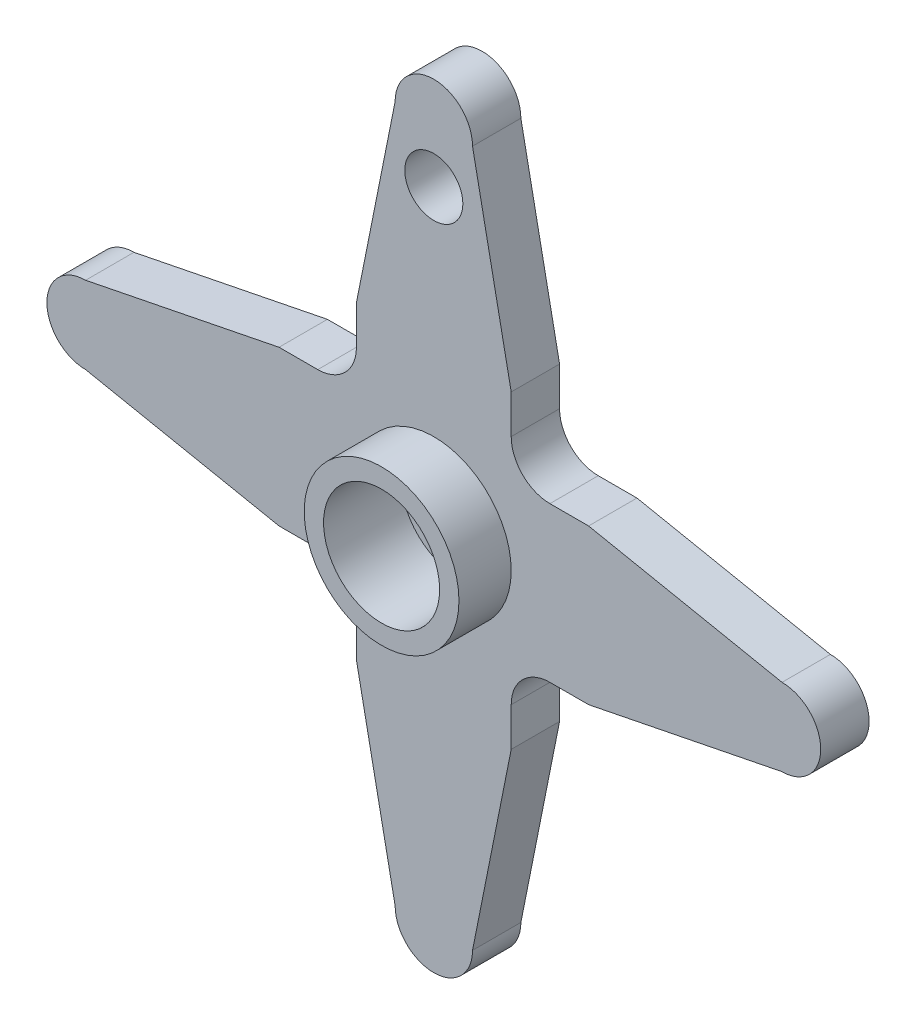
ISO-10303-21;
HEADER;
FILE_DESCRIPTION(('STEP AP214'),'2;1');
FILE_NAME('part.step','',(''),(''),'','','');
FILE_SCHEMA(('AUTOMOTIVE_DESIGN { 1 0 10303 214 1 1 1 1 }'));
ENDSEC;
DATA;
#1=APPLICATION_CONTEXT('core data for automotive mechanical design processes');
#2=APPLICATION_PROTOCOL_DEFINITION('international standard','automotive_design',2000,#1);
#3=PRODUCT_CONTEXT('',#1,'mechanical');
#4=PRODUCT('Part','Part','',(#3));
#5=PRODUCT_RELATED_PRODUCT_CATEGORY('part','',(#4));
#6=PRODUCT_DEFINITION_FORMATION('','',#4);
#7=PRODUCT_DEFINITION_CONTEXT('part definition',#1,'design');
#8=PRODUCT_DEFINITION('design','',#6,#7);
#9=PRODUCT_DEFINITION_SHAPE('','',#8);
#10=(LENGTH_UNIT() NAMED_UNIT(*) SI_UNIT(.MILLI.,.METRE.));
#11=(NAMED_UNIT(*) PLANE_ANGLE_UNIT() SI_UNIT($,.RADIAN.));
#12=(NAMED_UNIT(*) SI_UNIT($,.STERADIAN.) SOLID_ANGLE_UNIT());
#13=UNCERTAINTY_MEASURE_WITH_UNIT(LENGTH_MEASURE(1.E-05),#10,'distance_accuracy_value','');
#14=(GEOMETRIC_REPRESENTATION_CONTEXT(3) GLOBAL_UNCERTAINTY_ASSIGNED_CONTEXT((#13)) GLOBAL_UNIT_ASSIGNED_CONTEXT((#10,
#11,#12)) REPRESENTATION_CONTEXT('',''));
#15=CARTESIAN_POINT('',(0.,0.,0.));
#16=DIRECTION('',(0.,0.,1.));
#17=DIRECTION('',(1.,0.,0.));
#18=AXIS2_PLACEMENT_3D('',#15,#16,#17);
#19=CARTESIAN_POINT('',(0.,18.,2.5));
#20=DIRECTION('',(0.,0.,-1.));
#21=DIRECTION('',(-1.,0.,0.));
#22=AXIS2_PLACEMENT_3D('',#19,#20,#21);
#23=CYLINDRICAL_SURFACE('',#22,2.);
#24=CARTESIAN_POINT('',(0.,18.,0.));
#25=DIRECTION('',(0.,0.,1.));
#26=DIRECTION('',(1.,0.,0.));
#27=AXIS2_PLACEMENT_3D('',#24,#25,#26);
#28=CIRCLE('',#27,2.);
#29=CARTESIAN_POINT('',(2.,18.,0.));
#30=VERTEX_POINT('',#29);
#31=CARTESIAN_POINT('',(-2.,18.,0.));
#32=VERTEX_POINT('',#31);
#33=EDGE_CURVE('E275',#30,#32,#28,.T.);
#34=ORIENTED_EDGE('',*,*,#33,.T.);
#35=DIRECTION('',(0.,0.,-1.));
#36=VECTOR('',#35,1.);
#37=CARTESIAN_POINT('',(-2.,18.,2.5));
#38=LINE('',#37,#36);
#39=CARTESIAN_POINT('',(-2.,18.,2.5));
#40=VERTEX_POINT('',#39);
#41=EDGE_CURVE('E19',#40,#32,#38,.T.);
#42=ORIENTED_EDGE('',*,*,#41,.F.);
#43=CARTESIAN_POINT('',(0.,18.,2.5));
#44=DIRECTION('',(0.,0.,1.));
#45=DIRECTION('',(1.,0.,0.));
#46=AXIS2_PLACEMENT_3D('',#43,#44,#45);
#47=CIRCLE('',#46,2.);
#48=CARTESIAN_POINT('',(2.,18.,2.5));
#49=VERTEX_POINT('',#48);
#50=EDGE_CURVE('E153',#49,#40,#47,.T.);
#51=ORIENTED_EDGE('',*,*,#50,.F.);
#52=DIRECTION('',(0.,0.,-1.));
#53=VECTOR('',#52,1.);
#54=CARTESIAN_POINT('',(2.,18.,2.5));
#55=LINE('',#54,#53);
#56=EDGE_CURVE('E274',#49,#30,#55,.T.);
#57=ORIENTED_EDGE('',*,*,#56,.T.);
#58=EDGE_LOOP('',(#34,#42,#51,#57));
#59=FACE_BOUND('',#58,.T.);
#60=ADVANCED_FACE('F16',(#59),#23,.T.);
#61=CARTESIAN_POINT('',(-3.,13.,2.5));
#62=DIRECTION('',(-0.98058067569092,0.196116135138184,0.));
#63=DIRECTION('',(-0.196116135138184,-0.98058067569092,0.));
#64=AXIS2_PLACEMENT_3D('',#61,#62,#63);
#65=PLANE('',#64);
#66=DIRECTION('',(0.196116135138184,0.98058067569092,0.));
#67=VECTOR('',#66,1.);
#68=CARTESIAN_POINT('',(-3.,13.,0.));
#69=LINE('',#68,#67);
#70=CARTESIAN_POINT('',(-4.,8.,0.));
#71=VERTEX_POINT('',#70);
#72=EDGE_CURVE('E292',#71,#32,#69,.T.);
#73=ORIENTED_EDGE('',*,*,#72,.F.);
#74=DIRECTION('',(0.,0.,-1.));
#75=VECTOR('',#74,1.);
#76=CARTESIAN_POINT('',(-4.,8.,2.5));
#77=LINE('',#76,#75);
#78=CARTESIAN_POINT('',(-4.,8.,2.5));
#79=VERTEX_POINT('',#78);
#80=EDGE_CURVE('E410',#79,#71,#77,.T.);
#81=ORIENTED_EDGE('',*,*,#80,.F.);
#82=DIRECTION('',(0.196116135138184,0.98058067569092,0.));
#83=VECTOR('',#82,1.);
#84=CARTESIAN_POINT('',(-3.,13.,2.5));
#85=LINE('',#84,#83);
#86=EDGE_CURVE('E440',#79,#40,#85,.T.);
#87=ORIENTED_EDGE('',*,*,#86,.T.);
#88=ORIENTED_EDGE('',*,*,#41,.T.);
#89=EDGE_LOOP('',(#73,#81,#87,#88));
#90=FACE_BOUND('',#89,.T.);
#91=ADVANCED_FACE('F437',(#90),#65,.T.);
#92=CARTESIAN_POINT('',(-4.,7.,2.5));
#93=DIRECTION('',(1.,0.,0.));
#94=DIRECTION('',(0.,0.,-1.));
#95=AXIS2_PLACEMENT_3D('',#92,#93,#94);
#96=PLANE('',#95);
#97=DIRECTION('',(0.,-1.,0.));
#98=VECTOR('',#97,1.);
#99=CARTESIAN_POINT('',(-4.,7.,0.));
#100=LINE('',#99,#98);
#101=CARTESIAN_POINT('',(-4.,6.,0.));
#102=VERTEX_POINT('',#101);
#103=EDGE_CURVE('E296',#71,#102,#100,.T.);
#104=ORIENTED_EDGE('',*,*,#103,.T.);
#105=DIRECTION('',(0.,0.,-1.));
#106=VECTOR('',#105,1.);
#107=CARTESIAN_POINT('',(-4.,6.,2.5));
#108=LINE('',#107,#106);
#109=CARTESIAN_POINT('',(-4.,6.,2.5));
#110=VERTEX_POINT('',#109);
#111=EDGE_CURVE('E407',#110,#102,#108,.T.);
#112=ORIENTED_EDGE('',*,*,#111,.F.);
#113=DIRECTION('',(0.,-1.,0.));
#114=VECTOR('',#113,1.);
#115=CARTESIAN_POINT('',(-4.,7.,2.5));
#116=LINE('',#115,#114);
#117=EDGE_CURVE('E453',#79,#110,#116,.T.);
#118=ORIENTED_EDGE('',*,*,#117,.F.);
#119=ORIENTED_EDGE('',*,*,#80,.T.);
#120=EDGE_LOOP('',(#104,#112,#118,#119));
#121=FACE_BOUND('',#120,.T.);
#122=ADVANCED_FACE('F532',(#121),#96,.F.);
#123=CARTESIAN_POINT('',(-6.,6.,2.5));
#124=DIRECTION('',(0.,0.,-1.));
#125=DIRECTION('',(-1.,0.,0.));
#126=AXIS2_PLACEMENT_3D('',#123,#124,#125);
#127=CYLINDRICAL_SURFACE('',#126,2.);
#128=CARTESIAN_POINT('',(-6.,6.,0.));
#129=DIRECTION('',(0.,0.,1.));
#130=DIRECTION('',(1.,0.,0.));
#131=AXIS2_PLACEMENT_3D('',#128,#129,#130);
#132=CIRCLE('',#131,2.);
#133=CARTESIAN_POINT('',(-6.,4.,0.));
#134=VERTEX_POINT('',#133);
#135=EDGE_CURVE('E300',#134,#102,#132,.T.);
#136=ORIENTED_EDGE('',*,*,#135,.F.);
#137=DIRECTION('',(0.,0.,-1.));
#138=VECTOR('',#137,1.);
#139=CARTESIAN_POINT('',(-6.,4.,2.5));
#140=LINE('',#139,#138);
#141=CARTESIAN_POINT('',(-6.,4.,2.5));
#142=VERTEX_POINT('',#141);
#143=EDGE_CURVE('E403',#142,#134,#140,.T.);
#144=ORIENTED_EDGE('',*,*,#143,.F.);
#145=CARTESIAN_POINT('',(-6.,6.,2.5));
#146=DIRECTION('',(0.,0.,1.));
#147=DIRECTION('',(1.,0.,0.));
#148=AXIS2_PLACEMENT_3D('',#145,#146,#147);
#149=CIRCLE('',#148,2.);
#150=EDGE_CURVE('E458',#142,#110,#149,.T.);
#151=ORIENTED_EDGE('',*,*,#150,.T.);
#152=ORIENTED_EDGE('',*,*,#111,.T.);
#153=EDGE_LOOP('',(#136,#144,#151,#152));
#154=FACE_BOUND('',#153,.T.);
#155=ADVANCED_FACE('F537',(#154),#127,.F.);
#156=CARTESIAN_POINT('',(-7.,4.,2.5));
#157=DIRECTION('',(0.,1.,0.));
#158=DIRECTION('',(0.,0.,1.));
#159=AXIS2_PLACEMENT_3D('',#156,#157,#158);
#160=PLANE('',#159);
#161=DIRECTION('',(1.,0.,0.));
#162=VECTOR('',#161,1.);
#163=CARTESIAN_POINT('',(-7.,4.,0.));
#164=LINE('',#163,#162);
#165=CARTESIAN_POINT('',(-8.,4.,0.));
#166=VERTEX_POINT('',#165);
#167=EDGE_CURVE('E304',#166,#134,#164,.T.);
#168=ORIENTED_EDGE('',*,*,#167,.F.);
#169=DIRECTION('',(0.,0.,-1.));
#170=VECTOR('',#169,1.);
#171=CARTESIAN_POINT('',(-8.,4.,2.5));
#172=LINE('',#171,#170);
#173=CARTESIAN_POINT('',(-8.,4.,2.5));
#174=VERTEX_POINT('',#173);
#175=EDGE_CURVE('E400',#174,#166,#172,.T.);
#176=ORIENTED_EDGE('',*,*,#175,.F.);
#177=DIRECTION('',(1.,0.,0.));
#178=VECTOR('',#177,1.);
#179=CARTESIAN_POINT('',(-7.,4.,2.5));
#180=LINE('',#179,#178);
#181=EDGE_CURVE('E469',#174,#142,#180,.T.);
#182=ORIENTED_EDGE('',*,*,#181,.T.);
#183=ORIENTED_EDGE('',*,*,#143,.T.);
#184=EDGE_LOOP('',(#168,#176,#182,#183));
#185=FACE_BOUND('',#184,.T.);
#186=ADVANCED_FACE('F564',(#185),#160,.T.);
#187=CARTESIAN_POINT('',(-13.,3.,2.5));
#188=DIRECTION('',(0.196116135138184,-0.98058067569092,0.));
#189=DIRECTION('',(0.98058067569092,0.196116135138184,0.));
#190=AXIS2_PLACEMENT_3D('',#187,#188,#189);
#191=PLANE('',#190);
#192=DIRECTION('',(-0.98058067569092,-0.196116135138184,0.));
#193=VECTOR('',#192,1.);
#194=CARTESIAN_POINT('',(-13.,3.,0.));
#195=LINE('',#194,#193);
#196=CARTESIAN_POINT('',(-18.,2.,0.));
#197=VERTEX_POINT('',#196);
#198=EDGE_CURVE('E308',#166,#197,#195,.T.);
#199=ORIENTED_EDGE('',*,*,#198,.T.);
#200=DIRECTION('',(0.,0.,-1.));
#201=VECTOR('',#200,1.);
#202=CARTESIAN_POINT('',(-18.,2.,2.5));
#203=LINE('',#202,#201);
#204=CARTESIAN_POINT('',(-18.,2.,2.5));
#205=VERTEX_POINT('',#204);
#206=EDGE_CURVE('E404',#205,#197,#203,.T.);
#207=ORIENTED_EDGE('',*,*,#206,.F.);
#208=DIRECTION('',(-0.98058067569092,-0.196116135138184,0.));
#209=VECTOR('',#208,1.);
#210=CARTESIAN_POINT('',(-13.,3.,2.5));
#211=LINE('',#210,#209);
#212=EDGE_CURVE('E473',#174,#205,#211,.T.);
#213=ORIENTED_EDGE('',*,*,#212,.F.);
#214=ORIENTED_EDGE('',*,*,#175,.T.);
#215=EDGE_LOOP('',(#199,#207,#213,#214));
#216=FACE_BOUND('',#215,.T.);
#217=ADVANCED_FACE('F555',(#216),#191,.F.);
#218=CARTESIAN_POINT('',(-18.,0.,2.5));
#219=DIRECTION('',(0.,0.,-1.));
#220=DIRECTION('',(-1.,0.,0.));
#221=AXIS2_PLACEMENT_3D('',#218,#219,#220);
#222=CYLINDRICAL_SURFACE('',#221,2.);
#223=CARTESIAN_POINT('',(-18.,0.,0.));
#224=DIRECTION('',(0.,0.,1.));
#225=DIRECTION('',(1.,0.,0.));
#226=AXIS2_PLACEMENT_3D('',#223,#224,#225);
#227=CIRCLE('',#226,2.);
#228=CARTESIAN_POINT('',(-18.,-2.,0.));
#229=VERTEX_POINT('',#228);
#230=EDGE_CURVE('E279',#197,#229,#227,.T.);
#231=ORIENTED_EDGE('',*,*,#230,.T.);
#232=DIRECTION('',(0.,0.,-1.));
#233=VECTOR('',#232,1.);
#234=CARTESIAN_POINT('',(-18.,-2.,2.5));
#235=LINE('',#234,#233);
#236=CARTESIAN_POINT('',(-18.,-2.,2.5));
#237=VERTEX_POINT('',#236);
#238=EDGE_CURVE('E399',#237,#229,#235,.T.);
#239=ORIENTED_EDGE('',*,*,#238,.F.);
#240=CARTESIAN_POINT('',(-18.,0.,2.5));
#241=DIRECTION('',(0.,0.,1.));
#242=DIRECTION('',(1.,0.,0.));
#243=AXIS2_PLACEMENT_3D('',#240,#241,#242);
#244=CIRCLE('',#243,2.);
#245=EDGE_CURVE('E578',#205,#237,#244,.T.);
#246=ORIENTED_EDGE('',*,*,#245,.F.);
#247=ORIENTED_EDGE('',*,*,#206,.T.);
#248=EDGE_LOOP('',(#231,#239,#246,#247));
#249=FACE_BOUND('',#248,.T.);
#250=ADVANCED_FACE('F552',(#249),#222,.T.);
#251=CARTESIAN_POINT('',(-13.,-3.,2.5));
#252=DIRECTION('',(-0.196116135138184,-0.98058067569092,0.));
#253=DIRECTION('',(0.98058067569092,-0.196116135138184,0.));
#254=AXIS2_PLACEMENT_3D('',#251,#252,#253);
#255=PLANE('',#254);
#256=DIRECTION('',(-0.98058067569092,0.196116135138184,0.));
#257=VECTOR('',#256,1.);
#258=CARTESIAN_POINT('',(-13.,-3.,0.));
#259=LINE('',#258,#257);
#260=CARTESIAN_POINT('',(-8.,-4.,0.));
#261=VERTEX_POINT('',#260);
#262=EDGE_CURVE('E311',#261,#229,#259,.T.);
#263=ORIENTED_EDGE('',*,*,#262,.F.);
#264=DIRECTION('',(0.,0.,-1.));
#265=VECTOR('',#264,1.);
#266=CARTESIAN_POINT('',(-8.,-4.,2.5));
#267=LINE('',#266,#265);
#268=CARTESIAN_POINT('',(-8.,-4.,2.5));
#269=VERTEX_POINT('',#268);
#270=EDGE_CURVE('E396',#269,#261,#267,.T.);
#271=ORIENTED_EDGE('',*,*,#270,.F.);
#272=DIRECTION('',(-0.98058067569092,0.196116135138184,0.));
#273=VECTOR('',#272,1.);
#274=CARTESIAN_POINT('',(-13.,-3.,2.5));
#275=LINE('',#274,#273);
#276=EDGE_CURVE('E476',#269,#237,#275,.T.);
#277=ORIENTED_EDGE('',*,*,#276,.T.);
#278=ORIENTED_EDGE('',*,*,#238,.T.);
#279=EDGE_LOOP('',(#263,#271,#277,#278));
#280=FACE_BOUND('',#279,.T.);
#281=ADVANCED_FACE('F554',(#280),#255,.T.);
#282=CARTESIAN_POINT('',(-7.,-4.,2.5));
#283=DIRECTION('',(0.,1.,0.));
#284=DIRECTION('',(-1.,0.,0.));
#285=AXIS2_PLACEMENT_3D('',#282,#283,#284);
#286=PLANE('',#285);
#287=DIRECTION('',(1.,0.,0.));
#288=VECTOR('',#287,1.);
#289=CARTESIAN_POINT('',(-7.,-4.,0.));
#290=LINE('',#289,#288);
#291=CARTESIAN_POINT('',(-6.,-4.,0.));
#292=VERTEX_POINT('',#291);
#293=EDGE_CURVE('E315',#261,#292,#290,.T.);
#294=ORIENTED_EDGE('',*,*,#293,.T.);
#295=DIRECTION('',(0.,0.,-1.));
#296=VECTOR('',#295,1.);
#297=CARTESIAN_POINT('',(-6.,-4.,2.5));
#298=LINE('',#297,#296);
#299=CARTESIAN_POINT('',(-6.,-4.,2.5));
#300=VERTEX_POINT('',#299);
#301=EDGE_CURVE('E393',#300,#292,#298,.T.);
#302=ORIENTED_EDGE('',*,*,#301,.F.);
#303=DIRECTION('',(1.,0.,0.));
#304=VECTOR('',#303,1.);
#305=CARTESIAN_POINT('',(-7.,-4.,2.5));
#306=LINE('',#305,#304);
#307=EDGE_CURVE('E480',#269,#300,#306,.T.);
#308=ORIENTED_EDGE('',*,*,#307,.F.);
#309=ORIENTED_EDGE('',*,*,#270,.T.);
#310=EDGE_LOOP('',(#294,#302,#308,#309));
#311=FACE_BOUND('',#310,.T.);
#312=ADVANCED_FACE('F561',(#311),#286,.F.);
#313=CARTESIAN_POINT('',(-6.,-6.,2.5));
#314=DIRECTION('',(0.,0.,-1.));
#315=DIRECTION('',(-1.,0.,0.));
#316=AXIS2_PLACEMENT_3D('',#313,#314,#315);
#317=CYLINDRICAL_SURFACE('',#316,2.);
#318=CARTESIAN_POINT('',(-6.,-6.,0.));
#319=DIRECTION('',(0.,0.,1.));
#320=DIRECTION('',(1.,0.,0.));
#321=AXIS2_PLACEMENT_3D('',#318,#319,#320);
#322=CIRCLE('',#321,2.);
#323=CARTESIAN_POINT('',(-4.,-6.,0.));
#324=VERTEX_POINT('',#323);
#325=EDGE_CURVE('E319',#324,#292,#322,.T.);
#326=ORIENTED_EDGE('',*,*,#325,.F.);
#327=DIRECTION('',(0.,0.,-1.));
#328=VECTOR('',#327,1.);
#329=CARTESIAN_POINT('',(-4.,-6.,2.5));
#330=LINE('',#329,#328);
#331=CARTESIAN_POINT('',(-4.,-6.,2.5));
#332=VERTEX_POINT('',#331);
#333=EDGE_CURVE('E389',#332,#324,#330,.T.);
#334=ORIENTED_EDGE('',*,*,#333,.F.);
#335=CARTESIAN_POINT('',(-6.,-6.,2.5));
#336=DIRECTION('',(0.,0.,1.));
#337=DIRECTION('',(1.,0.,0.));
#338=AXIS2_PLACEMENT_3D('',#335,#336,#337);
#339=CIRCLE('',#338,2.);
#340=EDGE_CURVE('E483',#332,#300,#339,.T.);
#341=ORIENTED_EDGE('',*,*,#340,.T.);
#342=ORIENTED_EDGE('',*,*,#301,.T.);
#343=EDGE_LOOP('',(#326,#334,#341,#342));
#344=FACE_BOUND('',#343,.T.);
#345=ADVANCED_FACE('F681',(#344),#317,.F.);
#346=CARTESIAN_POINT('',(-4.,-7.,2.5));
#347=DIRECTION('',(-1.,0.,0.));
#348=DIRECTION('',(0.,0.,1.));
#349=AXIS2_PLACEMENT_3D('',#346,#347,#348);
#350=PLANE('',#349);
#351=DIRECTION('',(0.,1.,0.));
#352=VECTOR('',#351,1.);
#353=CARTESIAN_POINT('',(-4.,-7.,0.));
#354=LINE('',#353,#352);
#355=CARTESIAN_POINT('',(-4.,-8.,0.));
#356=VERTEX_POINT('',#355);
#357=EDGE_CURVE('E323',#356,#324,#354,.T.);
#358=ORIENTED_EDGE('',*,*,#357,.F.);
#359=DIRECTION('',(0.,0.,-1.));
#360=VECTOR('',#359,1.);
#361=CARTESIAN_POINT('',(-4.,-8.,2.5));
#362=LINE('',#361,#360);
#363=CARTESIAN_POINT('',(-4.,-8.,2.5));
#364=VERTEX_POINT('',#363);
#365=EDGE_CURVE('E386',#364,#356,#362,.T.);
#366=ORIENTED_EDGE('',*,*,#365,.F.);
#367=DIRECTION('',(0.,1.,0.));
#368=VECTOR('',#367,1.);
#369=CARTESIAN_POINT('',(-4.,-7.,2.5));
#370=LINE('',#369,#368);
#371=EDGE_CURVE('E487',#364,#332,#370,.T.);
#372=ORIENTED_EDGE('',*,*,#371,.T.);
#373=ORIENTED_EDGE('',*,*,#333,.T.);
#374=EDGE_LOOP('',(#358,#366,#372,#373));
#375=FACE_BOUND('',#374,.T.);
#376=ADVANCED_FACE('F674',(#375),#350,.T.);
#377=CARTESIAN_POINT('',(-3.,-13.,2.5));
#378=DIRECTION('',(0.98058067569092,0.196116135138184,0.));
#379=DIRECTION('',(-0.196116135138184,0.98058067569092,0.));
#380=AXIS2_PLACEMENT_3D('',#377,#378,#379);
#381=PLANE('',#380);
#382=DIRECTION('',(0.196116135138184,-0.98058067569092,0.));
#383=VECTOR('',#382,1.);
#384=CARTESIAN_POINT('',(-3.,-13.,0.));
#385=LINE('',#384,#383);
#386=CARTESIAN_POINT('',(-2.,-18.,0.));
#387=VERTEX_POINT('',#386);
#388=EDGE_CURVE('E327',#356,#387,#385,.T.);
#389=ORIENTED_EDGE('',*,*,#388,.T.);
#390=DIRECTION('',(0.,0.,-1.));
#391=VECTOR('',#390,1.);
#392=CARTESIAN_POINT('',(-2.,-18.,2.5));
#393=LINE('',#392,#391);
#394=CARTESIAN_POINT('',(-2.,-18.,2.5));
#395=VERTEX_POINT('',#394);
#396=EDGE_CURVE('E390',#395,#387,#393,.T.);
#397=ORIENTED_EDGE('',*,*,#396,.F.);
#398=DIRECTION('',(0.196116135138184,-0.98058067569092,0.));
#399=VECTOR('',#398,1.);
#400=CARTESIAN_POINT('',(-3.,-13.,2.5));
#401=LINE('',#400,#399);
#402=EDGE_CURVE('E491',#364,#395,#401,.T.);
#403=ORIENTED_EDGE('',*,*,#402,.F.);
#404=ORIENTED_EDGE('',*,*,#365,.T.);
#405=EDGE_LOOP('',(#389,#397,#403,#404));
#406=FACE_BOUND('',#405,.T.);
#407=ADVANCED_FACE('F550',(#406),#381,.F.);
#408=CARTESIAN_POINT('',(0.,-18.,2.5));
#409=DIRECTION('',(0.,0.,-1.));
#410=DIRECTION('',(-1.,0.,0.));
#411=AXIS2_PLACEMENT_3D('',#408,#409,#410);
#412=CYLINDRICAL_SURFACE('',#411,2.);
#413=CARTESIAN_POINT('',(0.,-18.,0.));
#414=DIRECTION('',(0.,0.,-1.));
#415=DIRECTION('',(1.,0.,0.));
#416=AXIS2_PLACEMENT_3D('',#413,#414,#415);
#417=CIRCLE('',#416,2.);
#418=CARTESIAN_POINT('',(2.,-18.,0.));
#419=VERTEX_POINT('',#418);
#420=EDGE_CURVE('E284',#419,#387,#417,.T.);
#421=ORIENTED_EDGE('',*,*,#420,.F.);
#422=DIRECTION('',(0.,0.,-1.));
#423=VECTOR('',#422,1.);
#424=CARTESIAN_POINT('',(2.,-18.,2.5));
#425=LINE('',#424,#423);
#426=CARTESIAN_POINT('',(2.,-18.,2.5));
#427=VERTEX_POINT('',#426);
#428=EDGE_CURVE('E385',#427,#419,#425,.T.);
#429=ORIENTED_EDGE('',*,*,#428,.F.);
#430=CARTESIAN_POINT('',(0.,-18.,2.5));
#431=DIRECTION('',(0.,0.,-1.));
#432=DIRECTION('',(1.,0.,0.));
#433=AXIS2_PLACEMENT_3D('',#430,#431,#432);
#434=CIRCLE('',#433,2.);
#435=EDGE_CURVE('E462',#427,#395,#434,.T.);
#436=ORIENTED_EDGE('',*,*,#435,.T.);
#437=ORIENTED_EDGE('',*,*,#396,.T.);
#438=EDGE_LOOP('',(#421,#429,#436,#437));
#439=FACE_BOUND('',#438,.T.);
#440=ADVANCED_FACE('F547',(#439),#412,.T.);
#441=CARTESIAN_POINT('',(3.,-13.,2.5));
#442=DIRECTION('',(0.98058067569092,-0.196116135138184,0.));
#443=DIRECTION('',(0.196116135138184,0.98058067569092,0.));
#444=AXIS2_PLACEMENT_3D('',#441,#442,#443);
#445=PLANE('',#444);
#446=DIRECTION('',(-0.196116135138184,-0.98058067569092,0.));
#447=VECTOR('',#446,1.);
#448=CARTESIAN_POINT('',(3.,-13.,0.));
#449=LINE('',#448,#447);
#450=CARTESIAN_POINT('',(4.,-8.,0.));
#451=VERTEX_POINT('',#450);
#452=EDGE_CURVE('E331',#451,#419,#449,.T.);
#453=ORIENTED_EDGE('',*,*,#452,.F.);
#454=DIRECTION('',(0.,0.,-1.));
#455=VECTOR('',#454,1.);
#456=CARTESIAN_POINT('',(4.,-8.,2.5));
#457=LINE('',#456,#455);
#458=CARTESIAN_POINT('',(4.,-8.,2.5));
#459=VERTEX_POINT('',#458);
#460=EDGE_CURVE('E382',#459,#451,#457,.T.);
#461=ORIENTED_EDGE('',*,*,#460,.F.);
#462=DIRECTION('',(-0.196116135138184,-0.98058067569092,0.));
#463=VECTOR('',#462,1.);
#464=CARTESIAN_POINT('',(3.,-13.,2.5));
#465=LINE('',#464,#463);
#466=EDGE_CURVE('E494',#459,#427,#465,.T.);
#467=ORIENTED_EDGE('',*,*,#466,.T.);
#468=ORIENTED_EDGE('',*,*,#428,.T.);
#469=EDGE_LOOP('',(#453,#461,#467,#468));
#470=FACE_BOUND('',#469,.T.);
#471=ADVANCED_FACE('F549',(#470),#445,.T.);
#472=CARTESIAN_POINT('',(4.,-7.,2.5));
#473=DIRECTION('',(-1.,0.,0.));
#474=DIRECTION('',(0.,0.,1.));
#475=AXIS2_PLACEMENT_3D('',#472,#473,#474);
#476=PLANE('',#475);
#477=DIRECTION('',(0.,1.,0.));
#478=VECTOR('',#477,1.);
#479=CARTESIAN_POINT('',(4.,-7.,0.));
#480=LINE('',#479,#478);
#481=CARTESIAN_POINT('',(4.,-6.,0.));
#482=VERTEX_POINT('',#481);
#483=EDGE_CURVE('E335',#451,#482,#480,.T.);
#484=ORIENTED_EDGE('',*,*,#483,.T.);
#485=DIRECTION('',(0.,0.,-1.));
#486=VECTOR('',#485,1.);
#487=CARTESIAN_POINT('',(4.,-6.,2.5));
#488=LINE('',#487,#486);
#489=CARTESIAN_POINT('',(4.,-6.,2.5));
#490=VERTEX_POINT('',#489);
#491=EDGE_CURVE('E379',#490,#482,#488,.T.);
#492=ORIENTED_EDGE('',*,*,#491,.F.);
#493=DIRECTION('',(0.,1.,0.));
#494=VECTOR('',#493,1.);
#495=CARTESIAN_POINT('',(4.,-7.,2.5));
#496=LINE('',#495,#494);
#497=EDGE_CURVE('E498',#459,#490,#496,.T.);
#498=ORIENTED_EDGE('',*,*,#497,.F.);
#499=ORIENTED_EDGE('',*,*,#460,.T.);
#500=EDGE_LOOP('',(#484,#492,#498,#499));
#501=FACE_BOUND('',#500,.T.);
#502=ADVANCED_FACE('F688',(#501),#476,.F.);
#503=CARTESIAN_POINT('',(6.,-6.,2.5));
#504=DIRECTION('',(0.,0.,-1.));
#505=DIRECTION('',(-1.,0.,0.));
#506=AXIS2_PLACEMENT_3D('',#503,#504,#505);
#507=CYLINDRICAL_SURFACE('',#506,2.);
#508=CARTESIAN_POINT('',(6.,-6.,0.));
#509=DIRECTION('',(0.,0.,1.));
#510=DIRECTION('',(1.,0.,0.));
#511=AXIS2_PLACEMENT_3D('',#508,#509,#510);
#512=CIRCLE('',#511,2.);
#513=CARTESIAN_POINT('',(6.,-4.,0.));
#514=VERTEX_POINT('',#513);
#515=EDGE_CURVE('E339',#514,#482,#512,.T.);
#516=ORIENTED_EDGE('',*,*,#515,.F.);
#517=DIRECTION('',(0.,0.,-1.));
#518=VECTOR('',#517,1.);
#519=CARTESIAN_POINT('',(6.,-4.,2.5));
#520=LINE('',#519,#518);
#521=CARTESIAN_POINT('',(6.,-4.,2.5));
#522=VERTEX_POINT('',#521);
#523=EDGE_CURVE('E375',#522,#514,#520,.T.);
#524=ORIENTED_EDGE('',*,*,#523,.F.);
#525=CARTESIAN_POINT('',(6.,-6.,2.5));
#526=DIRECTION('',(0.,0.,1.));
#527=DIRECTION('',(1.,0.,0.));
#528=AXIS2_PLACEMENT_3D('',#525,#526,#527);
#529=CIRCLE('',#528,2.);
#530=EDGE_CURVE('E501',#522,#490,#529,.T.);
#531=ORIENTED_EDGE('',*,*,#530,.T.);
#532=ORIENTED_EDGE('',*,*,#491,.T.);
#533=EDGE_LOOP('',(#516,#524,#531,#532));
#534=FACE_BOUND('',#533,.T.);
#535=ADVANCED_FACE('F695',(#534),#507,.F.);
#536=CARTESIAN_POINT('',(7.,-4.,2.5));
#537=DIRECTION('',(0.,-1.,0.));
#538=DIRECTION('',(1.,0.,0.));
#539=AXIS2_PLACEMENT_3D('',#536,#537,#538);
#540=PLANE('',#539);
#541=DIRECTION('',(-1.,0.,0.));
#542=VECTOR('',#541,1.);
#543=CARTESIAN_POINT('',(7.,-4.,0.));
#544=LINE('',#543,#542);
#545=CARTESIAN_POINT('',(8.,-4.,0.));
#546=VERTEX_POINT('',#545);
#547=EDGE_CURVE('E342',#546,#514,#544,.T.);
#548=ORIENTED_EDGE('',*,*,#547,.F.);
#549=DIRECTION('',(0.,0.,-1.));
#550=VECTOR('',#549,1.);
#551=CARTESIAN_POINT('',(8.,-4.,2.5));
#552=LINE('',#551,#550);
#553=CARTESIAN_POINT('',(8.,-4.,2.5));
#554=VERTEX_POINT('',#553);
#555=EDGE_CURVE('E372',#554,#546,#552,.T.);
#556=ORIENTED_EDGE('',*,*,#555,.F.);
#557=DIRECTION('',(-1.,0.,0.));
#558=VECTOR('',#557,1.);
#559=CARTESIAN_POINT('',(7.,-4.,2.5));
#560=LINE('',#559,#558);
#561=EDGE_CURVE('E505',#554,#522,#560,.T.);
#562=ORIENTED_EDGE('',*,*,#561,.T.);
#563=ORIENTED_EDGE('',*,*,#523,.T.);
#564=EDGE_LOOP('',(#548,#556,#562,#563));
#565=FACE_BOUND('',#564,.T.);
#566=ADVANCED_FACE('F726',(#565),#540,.T.);
#567=CARTESIAN_POINT('',(13.,-3.,2.5));
#568=DIRECTION('',(-0.196116135138184,0.98058067569092,0.));
#569=DIRECTION('',(-0.98058067569092,-0.196116135138184,0.));
#570=AXIS2_PLACEMENT_3D('',#567,#568,#569);
#571=PLANE('',#570);
#572=DIRECTION('',(0.98058067569092,0.196116135138184,0.));
#573=VECTOR('',#572,1.);
#574=CARTESIAN_POINT('',(13.,-3.,0.));
#575=LINE('',#574,#573);
#576=CARTESIAN_POINT('',(18.,-2.,0.));
#577=VERTEX_POINT('',#576);
#578=EDGE_CURVE('E346',#546,#577,#575,.T.);
#579=ORIENTED_EDGE('',*,*,#578,.T.);
#580=DIRECTION('',(0.,0.,-1.));
#581=VECTOR('',#580,1.);
#582=CARTESIAN_POINT('',(18.,-2.,2.5));
#583=LINE('',#582,#581);
#584=CARTESIAN_POINT('',(18.,-2.,2.5));
#585=VERTEX_POINT('',#584);
#586=EDGE_CURVE('E376',#585,#577,#583,.T.);
#587=ORIENTED_EDGE('',*,*,#586,.F.);
#588=DIRECTION('',(0.98058067569092,0.196116135138184,0.));
#589=VECTOR('',#588,1.);
#590=CARTESIAN_POINT('',(13.,-3.,2.5));
#591=LINE('',#590,#589);
#592=EDGE_CURVE('E509',#554,#585,#591,.T.);
#593=ORIENTED_EDGE('',*,*,#592,.F.);
#594=ORIENTED_EDGE('',*,*,#555,.T.);
#595=EDGE_LOOP('',(#579,#587,#593,#594));
#596=FACE_BOUND('',#595,.T.);
#597=ADVANCED_FACE('F545',(#596),#571,.F.);
#598=CARTESIAN_POINT('',(18.,0.,2.5));
#599=DIRECTION('',(0.,0.,-1.));
#600=DIRECTION('',(-1.,0.,0.));
#601=AXIS2_PLACEMENT_3D('',#598,#599,#600);
#602=CYLINDRICAL_SURFACE('',#601,2.);
#603=CARTESIAN_POINT('',(18.,0.,0.));
#604=DIRECTION('',(0.,0.,-1.));
#605=DIRECTION('',(1.,0.,0.));
#606=AXIS2_PLACEMENT_3D('',#603,#604,#605);
#607=CIRCLE('',#606,2.);
#608=CARTESIAN_POINT('',(18.,2.,0.));
#609=VERTEX_POINT('',#608);
#610=EDGE_CURVE('E288',#609,#577,#607,.T.);
#611=ORIENTED_EDGE('',*,*,#610,.F.);
#612=DIRECTION('',(0.,0.,-1.));
#613=VECTOR('',#612,1.);
#614=CARTESIAN_POINT('',(18.,2.,2.5));
#615=LINE('',#614,#613);
#616=CARTESIAN_POINT('',(18.,2.,2.5));
#617=VERTEX_POINT('',#616);
#618=EDGE_CURVE('E371',#617,#609,#615,.T.);
#619=ORIENTED_EDGE('',*,*,#618,.F.);
#620=CARTESIAN_POINT('',(18.,0.,2.5));
#621=DIRECTION('',(0.,0.,-1.));
#622=DIRECTION('',(1.,0.,0.));
#623=AXIS2_PLACEMENT_3D('',#620,#621,#622);
#624=CIRCLE('',#623,2.);
#625=EDGE_CURVE('E454',#617,#585,#624,.T.);
#626=ORIENTED_EDGE('',*,*,#625,.T.);
#627=ORIENTED_EDGE('',*,*,#586,.T.);
#628=EDGE_LOOP('',(#611,#619,#626,#627));
#629=FACE_BOUND('',#628,.T.);
#630=ADVANCED_FACE('F542',(#629),#602,.T.);
#631=CARTESIAN_POINT('',(13.,3.,2.5));
#632=DIRECTION('',(0.196116135138184,0.98058067569092,0.));
#633=DIRECTION('',(-0.98058067569092,0.196116135138184,0.));
#634=AXIS2_PLACEMENT_3D('',#631,#632,#633);
#635=PLANE('',#634);
#636=DIRECTION('',(0.98058067569092,-0.196116135138184,0.));
#637=VECTOR('',#636,1.);
#638=CARTESIAN_POINT('',(13.,3.,0.));
#639=LINE('',#638,#637);
#640=CARTESIAN_POINT('',(8.,4.,0.));
#641=VERTEX_POINT('',#640);
#642=EDGE_CURVE('E350',#641,#609,#639,.T.);
#643=ORIENTED_EDGE('',*,*,#642,.F.);
#644=DIRECTION('',(0.,0.,-1.));
#645=VECTOR('',#644,1.);
#646=CARTESIAN_POINT('',(8.,4.,2.5));
#647=LINE('',#646,#645);
#648=CARTESIAN_POINT('',(8.,4.,2.5));
#649=VERTEX_POINT('',#648);
#650=EDGE_CURVE('E258',#649,#641,#647,.T.);
#651=ORIENTED_EDGE('',*,*,#650,.F.);
#652=DIRECTION('',(0.98058067569092,-0.196116135138184,0.));
#653=VECTOR('',#652,1.);
#654=CARTESIAN_POINT('',(13.,3.,2.5));
#655=LINE('',#654,#653);
#656=EDGE_CURVE('E246',#649,#617,#655,.T.);
#657=ORIENTED_EDGE('',*,*,#656,.T.);
#658=ORIENTED_EDGE('',*,*,#618,.T.);
#659=EDGE_LOOP('',(#643,#651,#657,#658));
#660=FACE_BOUND('',#659,.T.);
#661=ADVANCED_FACE('F515',(#660),#635,.T.);
#662=CARTESIAN_POINT('',(7.,4.,2.5));
#663=DIRECTION('',(0.,-1.,0.));
#664=DIRECTION('',(0.,0.,-1.));
#665=AXIS2_PLACEMENT_3D('',#662,#663,#664);
#666=PLANE('',#665);
#667=DIRECTION('',(-1.,0.,0.));
#668=VECTOR('',#667,1.);
#669=CARTESIAN_POINT('',(7.,4.,0.));
#670=LINE('',#669,#668);
#671=CARTESIAN_POINT('',(6.,4.,0.));
#672=VERTEX_POINT('',#671);
#673=EDGE_CURVE('E254',#641,#672,#670,.T.);
#674=ORIENTED_EDGE('',*,*,#673,.T.);
#675=DIRECTION('',(0.,0.,-1.));
#676=VECTOR('',#675,1.);
#677=CARTESIAN_POINT('',(6.,4.,2.5));
#678=LINE('',#677,#676);
#679=CARTESIAN_POINT('',(6.,4.,2.5));
#680=VERTEX_POINT('',#679);
#681=EDGE_CURVE('E251',#680,#672,#678,.T.);
#682=ORIENTED_EDGE('',*,*,#681,.F.);
#683=DIRECTION('',(-1.,0.,0.));
#684=VECTOR('',#683,1.);
#685=CARTESIAN_POINT('',(7.,4.,2.5));
#686=LINE('',#685,#684);
#687=EDGE_CURVE('E238',#649,#680,#686,.T.);
#688=ORIENTED_EDGE('',*,*,#687,.F.);
#689=ORIENTED_EDGE('',*,*,#650,.T.);
#690=EDGE_LOOP('',(#674,#682,#688,#689));
#691=FACE_BOUND('',#690,.T.);
#692=ADVANCED_FACE('F252',(#691),#666,.F.);
#693=CARTESIAN_POINT('',(6.,6.,2.5));
#694=DIRECTION('',(0.,0.,-1.));
#695=DIRECTION('',(-1.,0.,0.));
#696=AXIS2_PLACEMENT_3D('',#693,#694,#695);
#697=CYLINDRICAL_SURFACE('',#696,2.);
#698=CARTESIAN_POINT('',(6.,6.,0.));
#699=DIRECTION('',(0.,0.,1.));
#700=DIRECTION('',(1.,0.,0.));
#701=AXIS2_PLACEMENT_3D('',#698,#699,#700);
#702=CIRCLE('',#701,2.);
#703=CARTESIAN_POINT('',(4.,6.,0.));
#704=VERTEX_POINT('',#703);
#705=EDGE_CURVE('E356',#704,#672,#702,.T.);
#706=ORIENTED_EDGE('',*,*,#705,.F.);
#707=DIRECTION('',(0.,0.,-1.));
#708=VECTOR('',#707,1.);
#709=CARTESIAN_POINT('',(4.,6.,2.5));
#710=LINE('',#709,#708);
#711=CARTESIAN_POINT('',(4.,6.,2.5));
#712=VERTEX_POINT('',#711);
#713=EDGE_CURVE('E137',#712,#704,#710,.T.);
#714=ORIENTED_EDGE('',*,*,#713,.F.);
#715=CARTESIAN_POINT('',(6.,6.,2.5));
#716=DIRECTION('',(0.,0.,1.));
#717=DIRECTION('',(1.,0.,0.));
#718=AXIS2_PLACEMENT_3D('',#715,#716,#717);
#719=CIRCLE('',#718,2.);
#720=EDGE_CURVE('E243',#712,#680,#719,.T.);
#721=ORIENTED_EDGE('',*,*,#720,.T.);
#722=ORIENTED_EDGE('',*,*,#681,.T.);
#723=EDGE_LOOP('',(#706,#714,#721,#722));
#724=FACE_BOUND('',#723,.T.);
#725=ADVANCED_FACE('F260',(#724),#697,.F.);
#726=CARTESIAN_POINT('',(4.,7.,2.5));
#727=DIRECTION('',(1.,0.,0.));
#728=DIRECTION('',(0.,0.,-1.));
#729=AXIS2_PLACEMENT_3D('',#726,#727,#728);
#730=PLANE('',#729);
#731=DIRECTION('',(0.,-1.,0.));
#732=VECTOR('',#731,1.);
#733=CARTESIAN_POINT('',(4.,7.,0.));
#734=LINE('',#733,#732);
#735=CARTESIAN_POINT('',(4.,8.,0.));
#736=VERTEX_POINT('',#735);
#737=EDGE_CURVE('E358',#736,#704,#734,.T.);
#738=ORIENTED_EDGE('',*,*,#737,.F.);
#739=DIRECTION('',(0.,0.,-1.));
#740=VECTOR('',#739,1.);
#741=CARTESIAN_POINT('',(4.,8.,2.5));
#742=LINE('',#741,#740);
#743=CARTESIAN_POINT('',(4.,8.,2.5));
#744=VERTEX_POINT('',#743);
#745=EDGE_CURVE('E39',#744,#736,#742,.T.);
#746=ORIENTED_EDGE('',*,*,#745,.F.);
#747=DIRECTION('',(0.,-1.,0.));
#748=VECTOR('',#747,1.);
#749=CARTESIAN_POINT('',(4.,7.,2.5));
#750=LINE('',#749,#748);
#751=EDGE_CURVE('E262',#744,#712,#750,.T.);
#752=ORIENTED_EDGE('',*,*,#751,.T.);
#753=ORIENTED_EDGE('',*,*,#713,.T.);
#754=EDGE_LOOP('',(#738,#746,#752,#753));
#755=FACE_BOUND('',#754,.T.);
#756=ADVANCED_FACE('F517',(#755),#730,.T.);
#757=CARTESIAN_POINT('',(3.,13.,2.5));
#758=DIRECTION('',(-0.98058067569092,-0.196116135138184,0.));
#759=DIRECTION('',(0.196116135138184,-0.98058067569092,0.));
#760=AXIS2_PLACEMENT_3D('',#757,#758,#759);
#761=PLANE('',#760);
#762=DIRECTION('',(-0.196116135138184,0.98058067569092,0.));
#763=VECTOR('',#762,1.);
#764=CARTESIAN_POINT('',(3.,13.,0.));
#765=LINE('',#764,#763);
#766=EDGE_CURVE('E362',#736,#30,#765,.T.);
#767=ORIENTED_EDGE('',*,*,#766,.T.);
#768=ORIENTED_EDGE('',*,*,#56,.F.);
#769=DIRECTION('',(-0.196116135138184,0.98058067569092,0.));
#770=VECTOR('',#769,1.);
#771=CARTESIAN_POINT('',(3.,13.,2.5));
#772=LINE('',#771,#770);
#773=EDGE_CURVE('E268',#744,#49,#772,.T.);
#774=ORIENTED_EDGE('',*,*,#773,.F.);
#775=ORIENTED_EDGE('',*,*,#745,.T.);
#776=EDGE_LOOP('',(#767,#768,#774,#775));
#777=FACE_BOUND('',#776,.T.);
#778=ADVANCED_FACE('F519',(#777),#761,.F.);
#779=CARTESIAN_POINT('',(0.,0.,2.5));
#780=DIRECTION('',(0.,0.,1.));
#781=DIRECTION('',(1.,0.,0.));
#782=AXIS2_PLACEMENT_3D('',#779,#780,#781);
#783=PLANE('',#782);
#784=CARTESIAN_POINT('',(0.,15.1724386960268,2.5));
#785=DIRECTION('',(0.,0.,1.));
#786=DIRECTION('',(1.,0.,0.));
#787=AXIS2_PLACEMENT_3D('',#784,#785,#786);
#788=CIRCLE('',#787,1.5);
#789=CARTESIAN_POINT('',(1.5,15.1724386960268,2.5));
#790=VERTEX_POINT('',#789);
#791=EDGE_CURVE('E601',#790,#790,#788,.T.);
#792=ORIENTED_EDGE('',*,*,#791,.F.);
#793=EDGE_LOOP('',(#792));
#794=FACE_BOUND('',#793,.T.);
#795=CARTESIAN_POINT('',(0.,0.,2.5));
#796=DIRECTION('',(0.,0.,1.));
#797=DIRECTION('',(1.,0.,0.));
#798=AXIS2_PLACEMENT_3D('',#795,#796,#797);
#799=CIRCLE('',#798,4.);
#800=CARTESIAN_POINT('',(4.,0.,2.5));
#801=VERTEX_POINT('',#800);
#802=EDGE_CURVE('E10',#801,#801,#799,.T.);
#803=ORIENTED_EDGE('',*,*,#802,.F.);
#804=EDGE_LOOP('',(#803));
#805=FACE_BOUND('',#804,.T.);
#806=ORIENTED_EDGE('',*,*,#50,.T.);
#807=ORIENTED_EDGE('',*,*,#86,.F.);
#808=ORIENTED_EDGE('',*,*,#117,.T.);
#809=ORIENTED_EDGE('',*,*,#150,.F.);
#810=ORIENTED_EDGE('',*,*,#181,.F.);
#811=ORIENTED_EDGE('',*,*,#212,.T.);
#812=ORIENTED_EDGE('',*,*,#245,.T.);
#813=ORIENTED_EDGE('',*,*,#276,.F.);
#814=ORIENTED_EDGE('',*,*,#307,.T.);
#815=ORIENTED_EDGE('',*,*,#340,.F.);
#816=ORIENTED_EDGE('',*,*,#371,.F.);
#817=ORIENTED_EDGE('',*,*,#402,.T.);
#818=ORIENTED_EDGE('',*,*,#435,.F.);
#819=ORIENTED_EDGE('',*,*,#466,.F.);
#820=ORIENTED_EDGE('',*,*,#497,.T.);
#821=ORIENTED_EDGE('',*,*,#530,.F.);
#822=ORIENTED_EDGE('',*,*,#561,.F.);
#823=ORIENTED_EDGE('',*,*,#592,.T.);
#824=ORIENTED_EDGE('',*,*,#625,.F.);
#825=ORIENTED_EDGE('',*,*,#656,.F.);
#826=ORIENTED_EDGE('',*,*,#687,.T.);
#827=ORIENTED_EDGE('',*,*,#720,.F.);
#828=ORIENTED_EDGE('',*,*,#751,.F.);
#829=ORIENTED_EDGE('',*,*,#773,.T.);
#830=EDGE_LOOP('',(#806,#807,#808,#809,#810,#811,#812,#813,#814,#815,#816,#817,#818,#819,#820,
#821,#822,#823,#824,#825,#826,#827,#828,#829));
#831=FACE_BOUND('',#830,.T.);
#832=ADVANCED_FACE('F240',(#794,#805,#831),#783,.T.);
#833=CARTESIAN_POINT('',(0.,0.,0.));
#834=DIRECTION('',(0.,0.,1.));
#835=DIRECTION('',(1.,0.,0.));
#836=AXIS2_PLACEMENT_3D('',#833,#834,#835);
#837=PLANE('',#836);
#838=CARTESIAN_POINT('',(0.,15.1724386960268,0.));
#839=DIRECTION('',(0.,0.,1.));
#840=DIRECTION('',(1.,0.,0.));
#841=AXIS2_PLACEMENT_3D('',#838,#839,#840);
#842=CIRCLE('',#841,1.5);
#843=CARTESIAN_POINT('',(1.5,15.1724386960268,0.));
#844=VERTEX_POINT('',#843);
#845=EDGE_CURVE('E600',#844,#844,#842,.T.);
#846=ORIENTED_EDGE('',*,*,#845,.T.);
#847=EDGE_LOOP('',(#846));
#848=FACE_BOUND('',#847,.T.);
#849=ORIENTED_EDGE('',*,*,#33,.F.);
#850=ORIENTED_EDGE('',*,*,#766,.F.);
#851=ORIENTED_EDGE('',*,*,#737,.T.);
#852=ORIENTED_EDGE('',*,*,#705,.T.);
#853=ORIENTED_EDGE('',*,*,#673,.F.);
#854=ORIENTED_EDGE('',*,*,#642,.T.);
#855=ORIENTED_EDGE('',*,*,#610,.T.);
#856=ORIENTED_EDGE('',*,*,#578,.F.);
#857=ORIENTED_EDGE('',*,*,#547,.T.);
#858=ORIENTED_EDGE('',*,*,#515,.T.);
#859=ORIENTED_EDGE('',*,*,#483,.F.);
#860=ORIENTED_EDGE('',*,*,#452,.T.);
#861=ORIENTED_EDGE('',*,*,#420,.T.);
#862=ORIENTED_EDGE('',*,*,#388,.F.);
#863=ORIENTED_EDGE('',*,*,#357,.T.);
#864=ORIENTED_EDGE('',*,*,#325,.T.);
#865=ORIENTED_EDGE('',*,*,#293,.F.);
#866=ORIENTED_EDGE('',*,*,#262,.T.);
#867=ORIENTED_EDGE('',*,*,#230,.F.);
#868=ORIENTED_EDGE('',*,*,#198,.F.);
#869=ORIENTED_EDGE('',*,*,#167,.T.);
#870=ORIENTED_EDGE('',*,*,#135,.T.);
#871=ORIENTED_EDGE('',*,*,#103,.F.);
#872=ORIENTED_EDGE('',*,*,#72,.T.);
#873=EDGE_LOOP('',(#849,#850,#851,#852,#853,#854,#855,#856,#857,#858,#859,#860,#861,#862,#863,
#864,#865,#866,#867,#868,#869,#870,#871,#872));
#874=FACE_BOUND('',#873,.T.);
#875=ADVANCED_FACE('F433',(#848,#874),#837,.F.);
#876=CARTESIAN_POINT('',(0.,0.,5.2));
#877=DIRECTION('',(0.,0.,-1.));
#878=DIRECTION('',(-1.,0.,0.));
#879=AXIS2_PLACEMENT_3D('',#876,#877,#878);
#880=CYLINDRICAL_SURFACE('',#879,4.);
#881=CARTESIAN_POINT('',(0.,0.,5.2));
#882=DIRECTION('',(0.,0.,1.));
#883=DIRECTION('',(1.,0.,0.));
#884=AXIS2_PLACEMENT_3D('',#881,#882,#883);
#885=CIRCLE('',#884,4.);
#886=CARTESIAN_POINT('',(4.,0.,5.2));
#887=VERTEX_POINT('',#886);
#888=EDGE_CURVE('E591',#887,#887,#885,.T.);
#889=ORIENTED_EDGE('',*,*,#888,.F.);
#890=EDGE_LOOP('',(#889));
#891=FACE_BOUND('',#890,.T.);
#892=ORIENTED_EDGE('',*,*,#802,.T.);
#893=EDGE_LOOP('',(#892));
#894=FACE_BOUND('',#893,.T.);
#895=ADVANCED_FACE('F624',(#891,#894),#880,.T.);
#896=CARTESIAN_POINT('',(0.,0.,5.2));
#897=DIRECTION('',(0.,0.,1.));
#898=DIRECTION('',(1.,0.,0.));
#899=AXIS2_PLACEMENT_3D('',#896,#897,#898);
#900=PLANE('',#899);
#901=CARTESIAN_POINT('',(0.,0.,5.2));
#902=DIRECTION('',(0.,0.,1.));
#903=DIRECTION('',(1.,0.,0.));
#904=AXIS2_PLACEMENT_3D('',#901,#902,#903);
#905=CIRCLE('',#904,3.);
#906=CARTESIAN_POINT('',(3.,0.,5.2));
#907=VERTEX_POINT('',#906);
#908=EDGE_CURVE('E596',#907,#907,#905,.T.);
#909=ORIENTED_EDGE('',*,*,#908,.F.);
#910=EDGE_LOOP('',(#909));
#911=FACE_BOUND('',#910,.T.);
#912=ORIENTED_EDGE('',*,*,#888,.T.);
#913=EDGE_LOOP('',(#912));
#914=FACE_BOUND('',#913,.T.);
#915=ADVANCED_FACE('F626',(#911,#914),#900,.T.);
#916=CARTESIAN_POINT('',(0.,0.,1.2));
#917=DIRECTION('',(0.,0.,1.));
#918=DIRECTION('',(1.,0.,0.));
#919=AXIS2_PLACEMENT_3D('',#916,#917,#918);
#920=PLANE('',#919);
#921=CARTESIAN_POINT('',(0.,0.,1.2));
#922=DIRECTION('',(0.,0.,1.));
#923=DIRECTION('',(1.,0.,0.));
#924=AXIS2_PLACEMENT_3D('',#921,#922,#923);
#925=CIRCLE('',#924,3.);
#926=CARTESIAN_POINT('',(3.,0.,1.2));
#927=VERTEX_POINT('',#926);
#928=EDGE_CURVE('E280',#927,#927,#925,.T.);
#929=ORIENTED_EDGE('',*,*,#928,.T.);
#930=EDGE_LOOP('',(#929));
#931=FACE_BOUND('',#930,.T.);
#932=ADVANCED_FACE('F633',(#931),#920,.T.);
#933=CARTESIAN_POINT('',(0.,0.,1.2));
#934=DIRECTION('',(0.,0.,1.));
#935=DIRECTION('',(1.,0.,0.));
#936=AXIS2_PLACEMENT_3D('',#933,#934,#935);
#937=CYLINDRICAL_SURFACE('',#936,3.);
#938=ORIENTED_EDGE('',*,*,#928,.F.);
#939=EDGE_LOOP('',(#938));
#940=FACE_BOUND('',#939,.T.);
#941=ORIENTED_EDGE('',*,*,#908,.T.);
#942=EDGE_LOOP('',(#941));
#943=FACE_BOUND('',#942,.T.);
#944=ADVANCED_FACE('F615',(#940,#943),#937,.F.);
#945=CARTESIAN_POINT('',(0.,15.1724386960268,0.));
#946=DIRECTION('',(0.,0.,1.));
#947=DIRECTION('',(1.,0.,0.));
#948=AXIS2_PLACEMENT_3D('',#945,#946,#947);
#949=CYLINDRICAL_SURFACE('',#948,1.5);
#950=ORIENTED_EDGE('',*,*,#845,.F.);
#951=EDGE_LOOP('',(#950));
#952=FACE_BOUND('',#951,.T.);
#953=ORIENTED_EDGE('',*,*,#791,.T.);
#954=EDGE_LOOP('',(#953));
#955=FACE_BOUND('',#954,.T.);
#956=ADVANCED_FACE('F612',(#952,#955),#949,.F.);
#957=CLOSED_SHELL('',(#60,#91,#122,#155,#186,#217,#250,#281,#312,#345,#376,#407,#440,#471,#502,
#535,#566,#597,#630,#661,#692,#725,#756,#778,#832,#875,#895,#915,#932,#944,#956));
#958=MANIFOLD_SOLID_BREP('B1',#957);
#959=ADVANCED_BREP_SHAPE_REPRESENTATION('',(#18,#958),#14);
#960=SHAPE_DEFINITION_REPRESENTATION(#9,#959);
ENDSEC;
END-ISO-10303-21;
